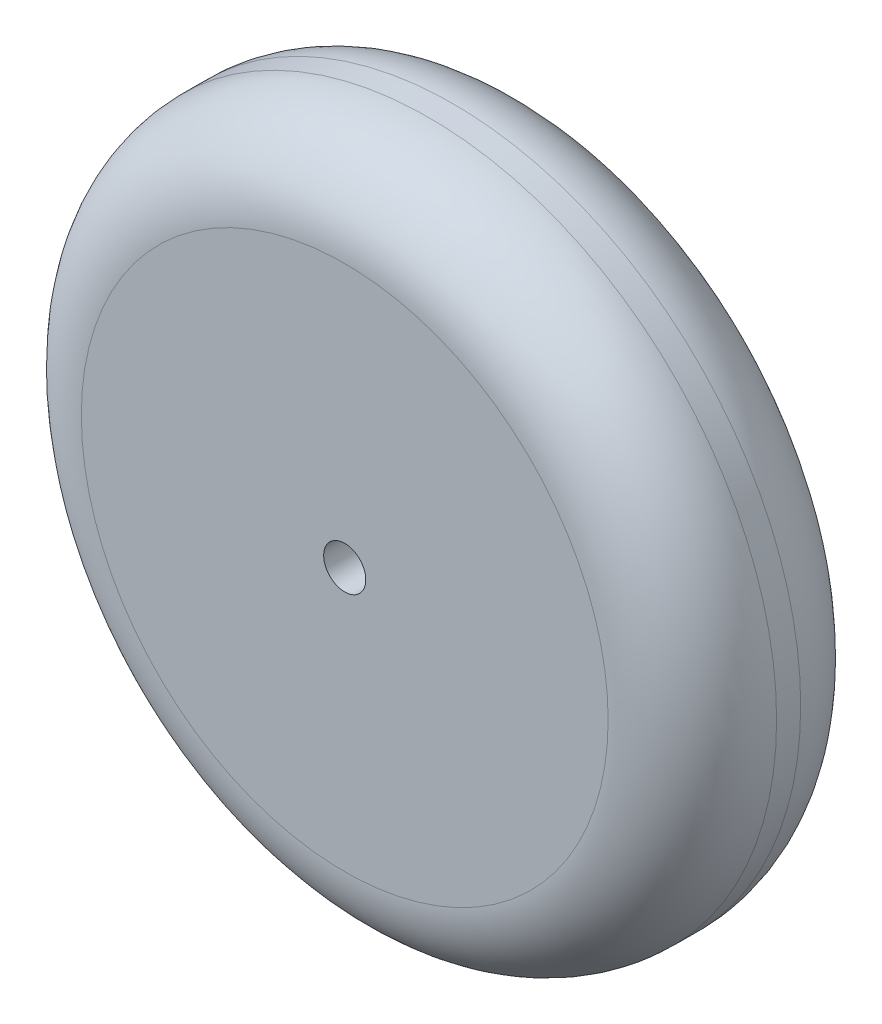
ISO-10303-21;
HEADER;
FILE_DESCRIPTION(('STEP AP214'),'2;1');
FILE_NAME('part.step','',(''),(''),'','','');
FILE_SCHEMA(('AUTOMOTIVE_DESIGN { 1 0 10303 214 1 1 1 1 }'));
ENDSEC;
DATA;
#1=APPLICATION_CONTEXT('core data for automotive mechanical design processes');
#2=APPLICATION_PROTOCOL_DEFINITION('international standard','automotive_design',2000,#1);
#3=PRODUCT_CONTEXT('',#1,'mechanical');
#4=PRODUCT('Part','Part','',(#3));
#5=PRODUCT_RELATED_PRODUCT_CATEGORY('part','',(#4));
#6=PRODUCT_DEFINITION_FORMATION('','',#4);
#7=PRODUCT_DEFINITION_CONTEXT('part definition',#1,'design');
#8=PRODUCT_DEFINITION('design','',#6,#7);
#9=PRODUCT_DEFINITION_SHAPE('','',#8);
#10=(LENGTH_UNIT() NAMED_UNIT(*) SI_UNIT(.MILLI.,.METRE.));
#11=(NAMED_UNIT(*) PLANE_ANGLE_UNIT() SI_UNIT($,.RADIAN.));
#12=(NAMED_UNIT(*) SI_UNIT($,.STERADIAN.) SOLID_ANGLE_UNIT());
#13=UNCERTAINTY_MEASURE_WITH_UNIT(LENGTH_MEASURE(1.E-05),#10,'distance_accuracy_value','');
#14=(GEOMETRIC_REPRESENTATION_CONTEXT(3) GLOBAL_UNCERTAINTY_ASSIGNED_CONTEXT((#13)) GLOBAL_UNIT_ASSIGNED_CONTEXT((#10,
#11,#12)) REPRESENTATION_CONTEXT('',''));
#15=CARTESIAN_POINT('',(0.,0.,0.));
#16=DIRECTION('',(0.,0.,1.));
#17=DIRECTION('',(1.,0.,0.));
#18=AXIS2_PLACEMENT_3D('',#15,#16,#17);
#19=CARTESIAN_POINT('',(0.,0.,22.86));
#20=DIRECTION('',(0.,0.,-1.));
#21=DIRECTION('',(-1.,0.,0.));
#22=AXIS2_PLACEMENT_3D('',#19,#20,#21);
#23=CYLINDRICAL_SURFACE('',#22,41.275);
#24=CARTESIAN_POINT('',(0.,0.,12.86));
#25=DIRECTION('',(0.,0.,1.));
#26=DIRECTION('',(1.,0.,0.));
#27=AXIS2_PLACEMENT_3D('',#24,#25,#26);
#28=CIRCLE('',#27,41.275);
#29=CARTESIAN_POINT('',(41.275,0.,12.86));
#30=VERTEX_POINT('',#29);
#31=EDGE_CURVE('E45',#30,#30,#28,.F.);
#32=ORIENTED_EDGE('',*,*,#31,.T.);
#33=EDGE_LOOP('',(#32));
#34=FACE_BOUND('',#33,.T.);
#35=CARTESIAN_POINT('',(0.,0.,10.));
#36=DIRECTION('',(0.,0.,1.));
#37=DIRECTION('',(1.,0.,0.));
#38=AXIS2_PLACEMENT_3D('',#35,#36,#37);
#39=CIRCLE('',#38,41.275);
#40=CARTESIAN_POINT('',(41.275,0.,10.));
#41=VERTEX_POINT('',#40);
#42=EDGE_CURVE('E50',#41,#41,#39,.T.);
#43=ORIENTED_EDGE('',*,*,#42,.T.);
#44=EDGE_LOOP('',(#43));
#45=FACE_BOUND('',#44,.T.);
#46=ADVANCED_FACE('F37',(#34,#45),#23,.T.);
#47=CARTESIAN_POINT('',(0.,0.,22.86));
#48=DIRECTION('',(0.,0.,1.));
#49=DIRECTION('',(1.,0.,0.));
#50=AXIS2_PLACEMENT_3D('',#47,#48,#49);
#51=PLANE('',#50);
#52=CARTESIAN_POINT('',(0.,0.,22.86));
#53=DIRECTION('',(0.,0.,1.));
#54=DIRECTION('',(1.,0.,0.));
#55=AXIS2_PLACEMENT_3D('',#52,#53,#54);
#56=CIRCLE('',#55,31.275);
#57=CARTESIAN_POINT('',(31.275,0.,22.86));
#58=VERTEX_POINT('',#57);
#59=EDGE_CURVE('E55',#58,#58,#56,.T.);
#60=ORIENTED_EDGE('',*,*,#59,.T.);
#61=EDGE_LOOP('',(#60));
#62=FACE_BOUND('',#61,.T.);
#63=CARTESIAN_POINT('',(0.,0.,22.86));
#64=DIRECTION('',(0.,0.,1.));
#65=DIRECTION('',(1.,0.,0.));
#66=AXIS2_PLACEMENT_3D('',#63,#64,#65);
#67=CIRCLE('',#66,2.5);
#68=CARTESIAN_POINT('',(-2.5,0.,22.86));
#69=VERTEX_POINT('',#68);
#70=EDGE_CURVE('E61',#69,#69,#67,.T.);
#71=ORIENTED_EDGE('',*,*,#70,.F.);
#72=EDGE_LOOP('',(#71));
#73=FACE_BOUND('',#72,.T.);
#74=ADVANCED_FACE('F82',(#62,#73),#51,.T.);
#75=CARTESIAN_POINT('',(0.,0.,0.));
#76=DIRECTION('',(0.,0.,1.));
#77=DIRECTION('',(1.,0.,0.));
#78=AXIS2_PLACEMENT_3D('',#75,#76,#77);
#79=PLANE('',#78);
#80=CARTESIAN_POINT('',(0.,0.,0.));
#81=DIRECTION('',(0.,0.,1.));
#82=DIRECTION('',(1.,0.,0.));
#83=AXIS2_PLACEMENT_3D('',#80,#81,#82);
#84=CIRCLE('',#83,31.275);
#85=CARTESIAN_POINT('',(31.275,0.,0.));
#86=VERTEX_POINT('',#85);
#87=EDGE_CURVE('E10',#86,#86,#84,.F.);
#88=ORIENTED_EDGE('',*,*,#87,.T.);
#89=EDGE_LOOP('',(#88));
#90=FACE_BOUND('',#89,.T.);
#91=CARTESIAN_POINT('',(0.,0.,0.));
#92=DIRECTION('',(0.,0.,1.));
#93=DIRECTION('',(1.,0.,0.));
#94=AXIS2_PLACEMENT_3D('',#91,#92,#93);
#95=CIRCLE('',#94,2.5);
#96=CARTESIAN_POINT('',(-2.5,0.,0.));
#97=VERTEX_POINT('',#96);
#98=EDGE_CURVE('E65',#97,#97,#95,.T.);
#99=ORIENTED_EDGE('',*,*,#98,.T.);
#100=EDGE_LOOP('',(#99));
#101=FACE_BOUND('',#100,.T.);
#102=ADVANCED_FACE('F70',(#90,#101),#79,.F.);
#103=CARTESIAN_POINT('',(0.,0.,22.861));
#104=DIRECTION('',(0.,0.,-1.));
#105=DIRECTION('',(-1.,0.,0.));
#106=AXIS2_PLACEMENT_3D('',#103,#104,#105);
#107=CYLINDRICAL_SURFACE('',#106,2.5);
#108=CARTESIAN_POINT('',(-2.5,0.,22.86));
#109=CARTESIAN_POINT('',(-2.5,0.,22.621875));
#110=CARTESIAN_POINT('',(-2.5,0.,22.38375));
#111=CARTESIAN_POINT('',(-2.5,0.,21.9075));
#112=CARTESIAN_POINT('',(-2.5,0.,21.669375));
#113=CARTESIAN_POINT('',(-2.5,0.,21.193125));
#114=CARTESIAN_POINT('',(-2.5,0.,20.955));
#115=CARTESIAN_POINT('',(-2.5,0.,20.47875));
#116=CARTESIAN_POINT('',(-2.5,0.,20.240625));
#117=CARTESIAN_POINT('',(-2.5,0.,19.764375));
#118=CARTESIAN_POINT('',(-2.5,0.,19.52625));
#119=CARTESIAN_POINT('',(-2.5,0.,19.05));
#120=CARTESIAN_POINT('',(-2.5,0.,18.811875));
#121=CARTESIAN_POINT('',(-2.5,0.,18.335625));
#122=CARTESIAN_POINT('',(-2.5,0.,18.0975));
#123=CARTESIAN_POINT('',(-2.5,0.,17.62125));
#124=CARTESIAN_POINT('',(-2.5,0.,17.383125));
#125=CARTESIAN_POINT('',(-2.5,0.,16.906875));
#126=CARTESIAN_POINT('',(-2.5,0.,16.66875));
#127=CARTESIAN_POINT('',(-2.5,0.,16.1925));
#128=CARTESIAN_POINT('',(-2.5,0.,15.954375));
#129=CARTESIAN_POINT('',(-2.5,0.,15.478125));
#130=CARTESIAN_POINT('',(-2.5,0.,15.24));
#131=CARTESIAN_POINT('',(-2.5,0.,14.76375));
#132=CARTESIAN_POINT('',(-2.5,0.,14.525625));
#133=CARTESIAN_POINT('',(-2.5,0.,14.049375));
#134=CARTESIAN_POINT('',(-2.5,0.,13.81125));
#135=CARTESIAN_POINT('',(-2.5,0.,13.335));
#136=CARTESIAN_POINT('',(-2.5,0.,13.096875));
#137=CARTESIAN_POINT('',(-2.5,0.,12.620625));
#138=CARTESIAN_POINT('',(-2.5,0.,12.3825));
#139=CARTESIAN_POINT('',(-2.5,0.,11.90625));
#140=CARTESIAN_POINT('',(-2.5,0.,11.668125));
#141=CARTESIAN_POINT('',(-2.5,0.,11.191875));
#142=CARTESIAN_POINT('',(-2.5,0.,10.95375));
#143=CARTESIAN_POINT('',(-2.5,0.,10.4775));
#144=CARTESIAN_POINT('',(-2.5,0.,10.239375));
#145=CARTESIAN_POINT('',(-2.5,0.,9.763125));
#146=CARTESIAN_POINT('',(-2.5,0.,9.525));
#147=CARTESIAN_POINT('',(-2.5,0.,9.04875));
#148=CARTESIAN_POINT('',(-2.5,0.,8.810625));
#149=CARTESIAN_POINT('',(-2.5,0.,8.334375));
#150=CARTESIAN_POINT('',(-2.5,0.,8.09625));
#151=CARTESIAN_POINT('',(-2.5,0.,7.62));
#152=CARTESIAN_POINT('',(-2.5,0.,7.381875));
#153=CARTESIAN_POINT('',(-2.5,0.,6.905625));
#154=CARTESIAN_POINT('',(-2.5,0.,6.6675));
#155=CARTESIAN_POINT('',(-2.5,0.,6.19125));
#156=CARTESIAN_POINT('',(-2.5,0.,5.953125));
#157=CARTESIAN_POINT('',(-2.5,0.,5.476875));
#158=CARTESIAN_POINT('',(-2.5,0.,5.23875));
#159=CARTESIAN_POINT('',(-2.5,0.,4.7625));
#160=CARTESIAN_POINT('',(-2.5,0.,4.524375));
#161=CARTESIAN_POINT('',(-2.5,0.,4.048125));
#162=CARTESIAN_POINT('',(-2.5,0.,3.81));
#163=CARTESIAN_POINT('',(-2.5,0.,3.33375));
#164=CARTESIAN_POINT('',(-2.5,0.,3.095625));
#165=CARTESIAN_POINT('',(-2.5,0.,2.619375));
#166=CARTESIAN_POINT('',(-2.5,0.,2.38125));
#167=CARTESIAN_POINT('',(-2.5,0.,1.905));
#168=CARTESIAN_POINT('',(-2.5,0.,1.666875));
#169=CARTESIAN_POINT('',(-2.5,0.,1.190625));
#170=CARTESIAN_POINT('',(-2.5,0.,0.952499999999996));
#171=CARTESIAN_POINT('',(-2.5,0.,0.476249999999996));
#172=CARTESIAN_POINT('',(-2.5,0.,0.238124999999996));
#173=CARTESIAN_POINT('',(-2.5,0.,0.));
#174=B_SPLINE_CURVE_WITH_KNOTS('',3,(#108,#109,#110,#111,#112,#113,#114,#115,#116,#117,#118,
#119,#120,#121,#122,#123,#124,#125,#126,#127,#128,#129,#130,#131,#132,#133,#134,#135,#136,#137,
#138,#139,#140,#141,#142,#143,#144,#145,#146,#147,#148,#149,#150,#151,#152,#153,#154,#155,#156,
#157,#158,#159,#160,#161,#162,#163,#164,#165,#166,#167,#168,#169,#170,#171,#172,#173),
.UNSPECIFIED.,.F.,.F.,(4,2,2,2,2,2,2,2,2,2,2,2,2,2,2,2,2,2,2,2,2,2,2,2,2,2,2,2,2,2,2,2,4),(0.,
0.714375,1.42875,2.143125,2.8575,3.571875,4.28625,5.000625,5.715,6.429375,7.14375,7.858125,
8.5725,9.286875,10.00125,10.715625,11.43,12.144375,12.85875,13.573125,14.2875,15.001875,
15.71625,16.430625,17.145,17.859375,18.57375,19.288125,20.0025,20.716875,21.43125,22.145625,
22.86),.UNSPECIFIED.);
#175=EDGE_CURVE('BSEAM72',#69,#97,#174,.T.);
#176=ORIENTED_EDGE('',*,*,#70,.T.);
#177=ORIENTED_EDGE('',*,*,#98,.F.);
#178=ORIENTED_EDGE('',*,*,#175,.T.);
#179=ORIENTED_EDGE('',*,*,#175,.F.);
#180=EDGE_LOOP('',(#176,#178,#177,#179));
#181=FACE_BOUND('',#180,.T.);
#182=ADVANCED_FACE('F72',(#181),#107,.F.);
#183=CARTESIAN_POINT('',(0.,0.,12.86));
#184=DIRECTION('',(0.,0.,1.));
#185=DIRECTION('',(1.,0.,0.));
#186=AXIS2_PLACEMENT_3D('',#183,#184,#185);
#187=TOROIDAL_SURFACE('',#186,31.275,10.);
#188=ORIENTED_EDGE('',*,*,#31,.F.);
#189=EDGE_LOOP('',(#188));
#190=FACE_BOUND('',#189,.T.);
#191=ORIENTED_EDGE('',*,*,#59,.F.);
#192=EDGE_LOOP('',(#191));
#193=FACE_BOUND('',#192,.T.);
#194=ADVANCED_FACE('F74',(#190,#193),#187,.T.);
#195=CARTESIAN_POINT('',(0.,0.,10.));
#196=DIRECTION('',(0.,0.,1.));
#197=DIRECTION('',(1.,0.,0.));
#198=AXIS2_PLACEMENT_3D('',#195,#196,#197);
#199=TOROIDAL_SURFACE('',#198,31.275,10.);
#200=ORIENTED_EDGE('',*,*,#87,.F.);
#201=EDGE_LOOP('',(#200));
#202=FACE_BOUND('',#201,.T.);
#203=ORIENTED_EDGE('',*,*,#42,.F.);
#204=EDGE_LOOP('',(#203));
#205=FACE_BOUND('',#204,.T.);
#206=ADVANCED_FACE('F39',(#202,#205),#199,.T.);
#207=CLOSED_SHELL('',(#46,#74,#102,#182,#194,#206));
#208=MANIFOLD_SOLID_BREP('B2',#207);
#209=ADVANCED_BREP_SHAPE_REPRESENTATION('',(#18,#208),#14);
#210=SHAPE_DEFINITION_REPRESENTATION(#9,#209);
ENDSEC;
END-ISO-10303-21;
